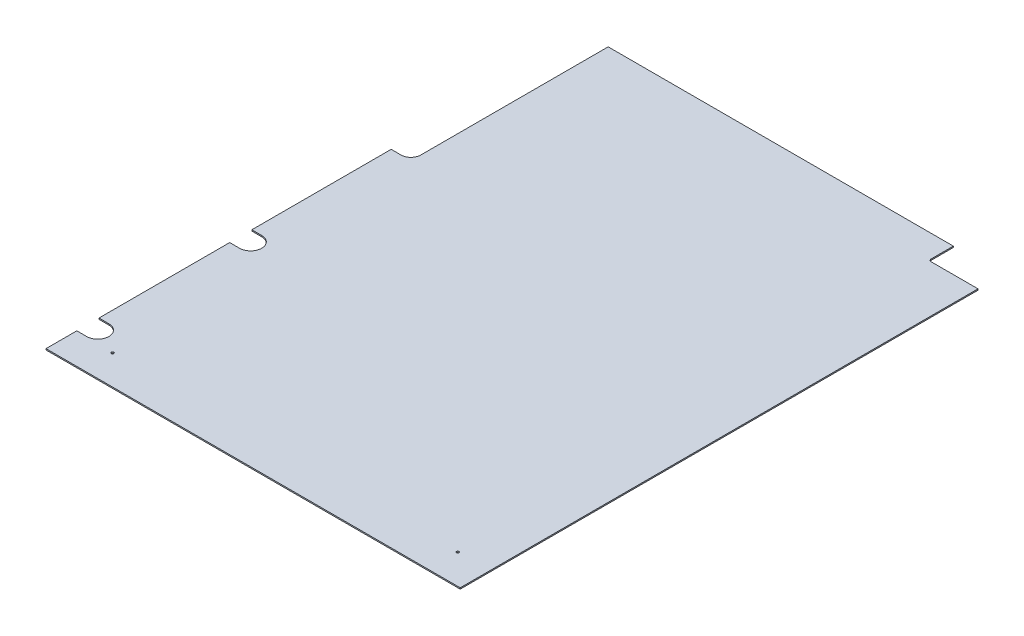
ISO-10303-21;
HEADER;
FILE_DESCRIPTION(('STEP AP214'),'2;1');
FILE_NAME('part.step','',(''),(''),'','','');
FILE_SCHEMA(('AUTOMOTIVE_DESIGN { 1 0 10303 214 1 1 1 1 }'));
ENDSEC;
DATA;
#1=APPLICATION_CONTEXT('core data for automotive mechanical design processes');
#2=APPLICATION_PROTOCOL_DEFINITION('international standard','automotive_design',2000,#1);
#3=PRODUCT_CONTEXT('',#1,'mechanical');
#4=PRODUCT('Part','Part','',(#3));
#5=PRODUCT_RELATED_PRODUCT_CATEGORY('part','',(#4));
#6=PRODUCT_DEFINITION_FORMATION('','',#4);
#7=PRODUCT_DEFINITION_CONTEXT('part definition',#1,'design');
#8=PRODUCT_DEFINITION('design','',#6,#7);
#9=PRODUCT_DEFINITION_SHAPE('','',#8);
#10=(LENGTH_UNIT() NAMED_UNIT(*) SI_UNIT(.MILLI.,.METRE.));
#11=(NAMED_UNIT(*) PLANE_ANGLE_UNIT() SI_UNIT($,.RADIAN.));
#12=(NAMED_UNIT(*) SI_UNIT($,.STERADIAN.) SOLID_ANGLE_UNIT());
#13=UNCERTAINTY_MEASURE_WITH_UNIT(LENGTH_MEASURE(1.E-05),#10,'distance_accuracy_value','');
#14=(GEOMETRIC_REPRESENTATION_CONTEXT(3) GLOBAL_UNCERTAINTY_ASSIGNED_CONTEXT((#13)) GLOBAL_UNIT_ASSIGNED_CONTEXT((#10,
#11,#12)) REPRESENTATION_CONTEXT('',''));
#15=CARTESIAN_POINT('',(0.,0.,0.));
#16=DIRECTION('',(0.,0.,1.));
#17=DIRECTION('',(1.,0.,0.));
#18=AXIS2_PLACEMENT_3D('',#15,#16,#17);
#19=CARTESIAN_POINT('',(0.,-540.385,698.5));
#20=DIRECTION('',(0.,-1.,0.));
#21=DIRECTION('',(0.,0.,-1.));
#22=AXIS2_PLACEMENT_3D('',#19,#20,#21);
#23=PLANE('',#22);
#24=CARTESIAN_POINT('',(-438.15,-540.385000000015,1320.8));
#25=DIRECTION('',(0.,1.,0.));
#26=DIRECTION('',(0.,0.,1.));
#27=AXIS2_PLACEMENT_3D('',#24,#25,#26);
#28=CIRCLE('',#27,3.175);
#29=CARTESIAN_POINT('',(-438.15,-540.385000000015,1323.975));
#30=VERTEX_POINT('',#29);
#31=EDGE_CURVE('E259',#30,#30,#28,.T.);
#32=ORIENTED_EDGE('',*,*,#31,.T.);
#33=EDGE_LOOP('',(#32));
#34=FACE_BOUND('',#33,.T.);
#35=CARTESIAN_POINT('',(450.85,-540.385000000015,1320.8));
#36=DIRECTION('',(0.,1.,0.));
#37=DIRECTION('',(0.,0.,1.));
#38=AXIS2_PLACEMENT_3D('',#35,#36,#37);
#39=CIRCLE('',#38,3.175);
#40=CARTESIAN_POINT('',(450.85,-540.385000000015,1323.975));
#41=VERTEX_POINT('',#40);
#42=EDGE_CURVE('E262',#41,#41,#39,.T.);
#43=ORIENTED_EDGE('',*,*,#42,.T.);
#44=EDGE_LOOP('',(#43));
#45=FACE_BOUND('',#44,.T.);
#46=DIRECTION('',(0.,0.,1.));
#47=VECTOR('',#46,1.);
#48=CARTESIAN_POINT('',(-533.4,-540.385,417.48526692391));
#49=LINE('',#48,#47);
#50=CARTESIAN_POINT('',(-533.4,-540.385000000005,508.));
#51=VERTEX_POINT('',#50);
#52=CARTESIAN_POINT('',(-533.4,-540.385,866.775));
#53=VERTEX_POINT('',#52);
#54=EDGE_CURVE('E170',#51,#53,#49,.T.);
#55=ORIENTED_EDGE('',*,*,#54,.F.);
#56=DIRECTION('',(1.,0.,0.));
#57=VECTOR('',#56,1.);
#58=CARTESIAN_POINT('',(-523.056139861752,-540.385000000015,508.));
#59=LINE('',#58,#57);
#60=CARTESIAN_POINT('',(-508.,-540.385000000015,508.));
#61=VERTEX_POINT('',#60);
#62=EDGE_CURVE('E139',#51,#61,#59,.T.);
#63=ORIENTED_EDGE('',*,*,#62,.T.);
#64=CARTESIAN_POINT('',(-508.,-540.385000000015,482.6));
#65=DIRECTION('',(0.,1.,0.));
#66=DIRECTION('',(0.,0.,1.));
#67=AXIS2_PLACEMENT_3D('',#64,#65,#66);
#68=CIRCLE('',#67,25.4);
#69=CARTESIAN_POINT('',(-482.6,-540.385000000015,482.6));
#70=VERTEX_POINT('',#69);
#71=EDGE_CURVE('E20',#61,#70,#68,.T.);
#72=ORIENTED_EDGE('',*,*,#71,.T.);
#73=DIRECTION('',(0.,0.,-1.));
#74=VECTOR('',#73,1.);
#75=CARTESIAN_POINT('',(-482.6,-540.385000000015,228.674650192228));
#76=LINE('',#75,#74);
#77=CARTESIAN_POINT('',(-482.6,-540.385000000005,0.));
#78=VERTEX_POINT('',#77);
#79=EDGE_CURVE('E143',#70,#78,#76,.T.);
#80=ORIENTED_EDGE('',*,*,#79,.T.);
#81=DIRECTION('',(-1.,0.,0.));
#82=VECTOR('',#81,1.);
#83=CARTESIAN_POINT('',(0.,-540.385,0.));
#84=LINE('',#83,#82);
#85=CARTESIAN_POINT('',(406.4,-540.38500000001,0.));
#86=VERTEX_POINT('',#85);
#87=EDGE_CURVE('E155',#86,#78,#84,.T.);
#88=ORIENTED_EDGE('',*,*,#87,.F.);
#89=DIRECTION('',(0.,0.,1.));
#90=VECTOR('',#89,1.);
#91=CARTESIAN_POINT('',(406.4,-540.385000000015,11.7346785634458));
#92=LINE('',#91,#90);
#93=CARTESIAN_POINT('',(406.4,-540.385000000015,57.1499999999873));
#94=VERTEX_POINT('',#93);
#95=EDGE_CURVE('E227',#86,#94,#92,.T.);
#96=ORIENTED_EDGE('',*,*,#95,.T.);
#97=CARTESIAN_POINT('',(412.75,-540.385000000015,57.1499999999746));
#98=DIRECTION('',(0.,1.,0.));
#99=DIRECTION('',(0.,0.,1.));
#100=AXIS2_PLACEMENT_3D('',#97,#98,#99);
#101=CIRCLE('',#100,6.35);
#102=CARTESIAN_POINT('',(412.75,-540.385000000015,63.4999999999746));
#103=VERTEX_POINT('',#102);
#104=EDGE_CURVE('E270',#94,#103,#101,.T.);
#105=ORIENTED_EDGE('',*,*,#104,.T.);
#106=DIRECTION('',(1.,0.,0.));
#107=VECTOR('',#106,1.);
#108=CARTESIAN_POINT('',(496.01742320066,-540.385000000015,63.4999999999746));
#109=LINE('',#108,#107);
#110=CARTESIAN_POINT('',(533.4,-540.385000000005,63.4999999999915));
#111=VERTEX_POINT('',#110);
#112=EDGE_CURVE('E222',#103,#111,#109,.T.);
#113=ORIENTED_EDGE('',*,*,#112,.T.);
#114=DIRECTION('',(0.,0.,1.));
#115=VECTOR('',#114,1.);
#116=CARTESIAN_POINT('',(533.4,-540.385,-53.4399999999996));
#117=LINE('',#116,#115);
#118=CARTESIAN_POINT('',(533.4,-540.385,1397.));
#119=VERTEX_POINT('',#118);
#120=EDGE_CURVE('E214',#111,#119,#117,.T.);
#121=ORIENTED_EDGE('',*,*,#120,.T.);
#122=DIRECTION('',(1.,0.,0.));
#123=VECTOR('',#122,1.);
#124=CARTESIAN_POINT('',(-586.839999999898,-540.385,1397.));
#125=LINE('',#124,#123);
#126=CARTESIAN_POINT('',(-533.4,-540.385,1397.));
#127=VERTEX_POINT('',#126);
#128=EDGE_CURVE('E212',#127,#119,#125,.T.);
#129=ORIENTED_EDGE('',*,*,#128,.F.);
#130=DIRECTION('',(0.,0.,1.));
#131=VECTOR('',#130,1.);
#132=CARTESIAN_POINT('',(-533.4,-540.385,417.48526692391));
#133=LINE('',#132,#131);
#134=CARTESIAN_POINT('',(-533.4,-540.385,1317.625));
#135=VERTEX_POINT('',#134);
#136=EDGE_CURVE('E207',#135,#127,#133,.T.);
#137=ORIENTED_EDGE('',*,*,#136,.F.);
#138=DIRECTION('',(-1.,0.,0.));
#139=VECTOR('',#138,1.);
#140=CARTESIAN_POINT('',(-519.281672702294,-540.385,1317.625));
#141=LINE('',#140,#139);
#142=CARTESIAN_POINT('',(-508.,-540.385,1317.625));
#143=VERTEX_POINT('',#142);
#144=EDGE_CURVE('E201',#143,#135,#141,.T.);
#145=ORIENTED_EDGE('',*,*,#144,.F.);
#146=CARTESIAN_POINT('',(-508.,-540.385,1289.05));
#147=DIRECTION('',(0.,-1.,0.));
#148=DIRECTION('',(0.,0.,-1.));
#149=AXIS2_PLACEMENT_3D('',#146,#147,#148);
#150=CIRCLE('',#149,28.575);
#151=CARTESIAN_POINT('',(-508.,-540.385,1260.475));
#152=VERTEX_POINT('',#151);
#153=EDGE_CURVE('E268',#143,#152,#150,.F.);
#154=ORIENTED_EDGE('',*,*,#153,.T.);
#155=DIRECTION('',(-1.,0.,0.));
#156=VECTOR('',#155,1.);
#157=CARTESIAN_POINT('',(-522.157213757906,-540.385,1260.475));
#158=LINE('',#157,#156);
#159=CARTESIAN_POINT('',(-533.4,-540.385,1260.475));
#160=VERTEX_POINT('',#159);
#161=EDGE_CURVE('E193',#152,#160,#158,.T.);
#162=ORIENTED_EDGE('',*,*,#161,.T.);
#163=DIRECTION('',(0.,0.,1.));
#164=VECTOR('',#163,1.);
#165=CARTESIAN_POINT('',(-533.4,-540.385,417.48526692391));
#166=LINE('',#165,#164);
#167=CARTESIAN_POINT('',(-533.4,-540.385,923.925));
#168=VERTEX_POINT('',#167);
#169=EDGE_CURVE('E191',#168,#160,#166,.T.);
#170=ORIENTED_EDGE('',*,*,#169,.F.);
#171=DIRECTION('',(-1.,0.,0.));
#172=VECTOR('',#171,1.);
#173=CARTESIAN_POINT('',(-522.75812590279,-540.385,923.925));
#174=LINE('',#173,#172);
#175=CARTESIAN_POINT('',(-508.,-540.385,923.925));
#176=VERTEX_POINT('',#175);
#177=EDGE_CURVE('E185',#176,#168,#174,.T.);
#178=ORIENTED_EDGE('',*,*,#177,.F.);
#179=CARTESIAN_POINT('',(-508.,-540.385,895.35));
#180=DIRECTION('',(0.,-1.,0.));
#181=DIRECTION('',(0.,0.,-1.));
#182=AXIS2_PLACEMENT_3D('',#179,#180,#181);
#183=CIRCLE('',#182,28.575);
#184=CARTESIAN_POINT('',(-508.,-540.385,866.775));
#185=VERTEX_POINT('',#184);
#186=EDGE_CURVE('E265',#176,#185,#183,.F.);
#187=ORIENTED_EDGE('',*,*,#186,.T.);
#188=DIRECTION('',(-1.,0.,0.));
#189=VECTOR('',#188,1.);
#190=CARTESIAN_POINT('',(-522.857470839736,-540.385,866.775));
#191=LINE('',#190,#189);
#192=EDGE_CURVE('E171',#185,#53,#191,.T.);
#193=ORIENTED_EDGE('',*,*,#192,.T.);
#194=EDGE_LOOP('',(#55,#63,#72,#80,#88,#96,#105,#113,#121,#129,#137,#145,#154,#162,#170,#178,
#187,#193));
#195=FACE_BOUND('',#194,.T.);
#196=ADVANCED_FACE('F17',(#34,#45,#195),#23,.T.);
#197=CARTESIAN_POINT('',(-523.056139861752,500000.000000032,508.));
#198=DIRECTION('',(0.,0.,1.));
#199=DIRECTION('',(1.,0.,0.));
#200=AXIS2_PLACEMENT_3D('',#197,#198,#199);
#201=PLANE('',#200);
#202=ORIENTED_EDGE('',*,*,#62,.F.);
#203=DIRECTION('',(0.,1.,0.));
#204=VECTOR('',#203,1.);
#205=CARTESIAN_POINT('',(-533.4,-540.385,508.));
#206=LINE('',#205,#204);
#207=CARTESIAN_POINT('',(-533.4,-537.21,508.));
#208=VERTEX_POINT('',#207);
#209=EDGE_CURVE('E167',#208,#51,#206,.F.);
#210=ORIENTED_EDGE('',*,*,#209,.F.);
#211=DIRECTION('',(1.,0.,0.));
#212=VECTOR('',#211,1.);
#213=CARTESIAN_POINT('',(0.,-537.21,508.));
#214=LINE('',#213,#212);
#215=CARTESIAN_POINT('',(-508.,-537.210000000126,508.));
#216=VERTEX_POINT('',#215);
#217=EDGE_CURVE('E258',#208,#216,#214,.T.);
#218=ORIENTED_EDGE('',*,*,#217,.T.);
#219=DIRECTION('',(0.,1.,0.));
#220=VECTOR('',#219,1.);
#221=CARTESIAN_POINT('',(-508.,500000.000000032,508.));
#222=LINE('',#221,#220);
#223=EDGE_CURVE('E149',#216,#61,#222,.F.);
#224=ORIENTED_EDGE('',*,*,#223,.T.);
#225=EDGE_LOOP('',(#202,#210,#218,#224));
#226=FACE_BOUND('',#225,.T.);
#227=ADVANCED_FACE('F581',(#226),#201,.F.);
#228=CARTESIAN_POINT('',(-508.,500000.000000032,482.6));
#229=DIRECTION('',(0.,1.,0.));
#230=DIRECTION('',(0.,0.,1.));
#231=AXIS2_PLACEMENT_3D('',#228,#229,#230);
#232=CYLINDRICAL_SURFACE('',#231,25.4);
#233=ORIENTED_EDGE('',*,*,#71,.F.);
#234=ORIENTED_EDGE('',*,*,#223,.F.);
#235=CARTESIAN_POINT('',(-508.,-537.210000000243,482.6));
#236=DIRECTION('',(0.,1.,0.));
#237=DIRECTION('',(0.,0.,1.));
#238=AXIS2_PLACEMENT_3D('',#235,#236,#237);
#239=CIRCLE('',#238,25.4);
#240=CARTESIAN_POINT('',(-482.6,-537.210000000126,482.6));
#241=VERTEX_POINT('',#240);
#242=EDGE_CURVE('E160',#216,#241,#239,.T.);
#243=ORIENTED_EDGE('',*,*,#242,.T.);
#244=DIRECTION('',(0.,1.,0.));
#245=VECTOR('',#244,1.);
#246=CARTESIAN_POINT('',(-482.6,500000.000000032,482.6));
#247=LINE('',#246,#245);
#248=EDGE_CURVE('E148',#241,#70,#247,.F.);
#249=ORIENTED_EDGE('',*,*,#248,.T.);
#250=EDGE_LOOP('',(#233,#234,#243,#249));
#251=FACE_BOUND('',#250,.T.);
#252=ADVANCED_FACE('F158',(#251),#232,.F.);
#253=CARTESIAN_POINT('',(-482.6,500000.000000032,228.674650192228));
#254=DIRECTION('',(1.,0.,0.));
#255=DIRECTION('',(0.,0.,-1.));
#256=AXIS2_PLACEMENT_3D('',#253,#254,#255);
#257=PLANE('',#256);
#258=ORIENTED_EDGE('',*,*,#79,.F.);
#259=ORIENTED_EDGE('',*,*,#248,.F.);
#260=DIRECTION('',(0.,0.,-1.));
#261=VECTOR('',#260,1.);
#262=CARTESIAN_POINT('',(-482.6,-537.21,698.5));
#263=LINE('',#262,#261);
#264=CARTESIAN_POINT('',(-482.6,-537.21,0.));
#265=VERTEX_POINT('',#264);
#266=EDGE_CURVE('E257',#241,#265,#263,.T.);
#267=ORIENTED_EDGE('',*,*,#266,.T.);
#268=DIRECTION('',(0.,1.,0.));
#269=VECTOR('',#268,1.);
#270=CARTESIAN_POINT('',(-482.6,-540.385,0.));
#271=LINE('',#270,#269);
#272=EDGE_CURVE('E154',#78,#265,#271,.T.);
#273=ORIENTED_EDGE('',*,*,#272,.F.);
#274=EDGE_LOOP('',(#258,#259,#267,#273));
#275=FACE_BOUND('',#274,.T.);
#276=ADVANCED_FACE('F151',(#275),#257,.F.);
#277=CARTESIAN_POINT('',(0.,-540.385,0.));
#278=DIRECTION('',(0.,0.,-1.));
#279=DIRECTION('',(-1.,0.,0.));
#280=AXIS2_PLACEMENT_3D('',#277,#278,#279);
#281=PLANE('',#280);
#282=ORIENTED_EDGE('',*,*,#87,.T.);
#283=ORIENTED_EDGE('',*,*,#272,.T.);
#284=DIRECTION('',(1.,0.,0.));
#285=VECTOR('',#284,1.);
#286=CARTESIAN_POINT('',(0.,-537.21,0.));
#287=LINE('',#286,#285);
#288=CARTESIAN_POINT('',(406.4,-537.210000000005,0.));
#289=VERTEX_POINT('',#288);
#290=EDGE_CURVE('E286',#265,#289,#287,.T.);
#291=ORIENTED_EDGE('',*,*,#290,.T.);
#292=DIRECTION('',(0.,1.,0.));
#293=VECTOR('',#292,1.);
#294=CARTESIAN_POINT('',(406.4,500000.000000032,0.));
#295=LINE('',#294,#293);
#296=EDGE_CURVE('E230',#289,#86,#295,.F.);
#297=ORIENTED_EDGE('',*,*,#296,.T.);
#298=EDGE_LOOP('',(#282,#283,#291,#297));
#299=FACE_BOUND('',#298,.T.);
#300=ADVANCED_FACE('F292',(#299),#281,.T.);
#301=CARTESIAN_POINT('',(406.4,500000.000000032,11.7346785634458));
#302=DIRECTION('',(-1.,0.,0.));
#303=DIRECTION('',(0.,0.,1.));
#304=AXIS2_PLACEMENT_3D('',#301,#302,#303);
#305=PLANE('',#304);
#306=ORIENTED_EDGE('',*,*,#95,.F.);
#307=ORIENTED_EDGE('',*,*,#296,.F.);
#308=DIRECTION('',(0.,0.,-1.));
#309=VECTOR('',#308,1.);
#310=CARTESIAN_POINT('',(406.4,-537.21,698.5));
#311=LINE('',#310,#309);
#312=CARTESIAN_POINT('',(406.4,-537.210000000012,57.1499999999873));
#313=VERTEX_POINT('',#312);
#314=EDGE_CURVE('E255',#289,#313,#311,.F.);
#315=ORIENTED_EDGE('',*,*,#314,.T.);
#316=DIRECTION('',(0.,1.,0.));
#317=VECTOR('',#316,1.);
#318=CARTESIAN_POINT('',(406.4,500000.000000032,57.15));
#319=LINE('',#318,#317);
#320=EDGE_CURVE('E229',#313,#94,#319,.F.);
#321=ORIENTED_EDGE('',*,*,#320,.T.);
#322=EDGE_LOOP('',(#306,#307,#315,#321));
#323=FACE_BOUND('',#322,.T.);
#324=ADVANCED_FACE('F395',(#323),#305,.F.);
#325=CARTESIAN_POINT('',(412.75,500000.000000032,57.1499999999746));
#326=DIRECTION('',(0.,1.,0.));
#327=DIRECTION('',(0.,0.,1.));
#328=AXIS2_PLACEMENT_3D('',#325,#326,#327);
#329=CYLINDRICAL_SURFACE('',#328,6.35);
#330=ORIENTED_EDGE('',*,*,#104,.F.);
#331=ORIENTED_EDGE('',*,*,#320,.F.);
#332=CARTESIAN_POINT('',(412.75,-537.210000000016,57.1499999999746));
#333=DIRECTION('',(0.,1.,0.));
#334=DIRECTION('',(0.,0.,1.));
#335=AXIS2_PLACEMENT_3D('',#332,#333,#334);
#336=CIRCLE('',#335,6.35);
#337=CARTESIAN_POINT('',(412.75,-537.210000000012,63.4999999999746));
#338=VERTEX_POINT('',#337);
#339=EDGE_CURVE('E251',#313,#338,#336,.T.);
#340=ORIENTED_EDGE('',*,*,#339,.T.);
#341=DIRECTION('',(0.,1.,0.));
#342=VECTOR('',#341,1.);
#343=CARTESIAN_POINT('',(412.75,500000.000000032,63.4999999999746));
#344=LINE('',#343,#342);
#345=EDGE_CURVE('E224',#338,#103,#344,.F.);
#346=ORIENTED_EDGE('',*,*,#345,.T.);
#347=EDGE_LOOP('',(#330,#331,#340,#346));
#348=FACE_BOUND('',#347,.T.);
#349=ADVANCED_FACE('F397',(#348),#329,.F.);
#350=CARTESIAN_POINT('',(496.01742320066,500000.000000032,63.4999999999746));
#351=DIRECTION('',(0.,0.,1.));
#352=DIRECTION('',(1.,0.,0.));
#353=AXIS2_PLACEMENT_3D('',#350,#351,#352);
#354=PLANE('',#353);
#355=ORIENTED_EDGE('',*,*,#112,.F.);
#356=ORIENTED_EDGE('',*,*,#345,.F.);
#357=DIRECTION('',(1.,0.,0.));
#358=VECTOR('',#357,1.);
#359=CARTESIAN_POINT('',(0.,-537.21,63.4999999999746));
#360=LINE('',#359,#358);
#361=CARTESIAN_POINT('',(533.4,-537.21,63.4999999999831));
#362=VERTEX_POINT('',#361);
#363=EDGE_CURVE('E254',#338,#362,#360,.T.);
#364=ORIENTED_EDGE('',*,*,#363,.T.);
#365=DIRECTION('',(0.,1.,0.));
#366=VECTOR('',#365,1.);
#367=CARTESIAN_POINT('',(533.4,-540.385,63.5));
#368=LINE('',#367,#366);
#369=EDGE_CURVE('E219',#362,#111,#368,.F.);
#370=ORIENTED_EDGE('',*,*,#369,.T.);
#371=EDGE_LOOP('',(#355,#356,#364,#370));
#372=FACE_BOUND('',#371,.T.);
#373=ADVANCED_FACE('F362',(#372),#354,.F.);
#374=CARTESIAN_POINT('',(533.4,-540.385,-53.4399999999996));
#375=DIRECTION('',(-1.,0.,0.));
#376=DIRECTION('',(0.,0.,1.));
#377=AXIS2_PLACEMENT_3D('',#374,#375,#376);
#378=PLANE('',#377);
#379=DIRECTION('',(0.,1.,0.));
#380=VECTOR('',#379,1.);
#381=CARTESIAN_POINT('',(533.4,-540.385,1397.));
#382=LINE('',#381,#380);
#383=CARTESIAN_POINT('',(533.4,-537.21,1397.));
#384=VERTEX_POINT('',#383);
#385=EDGE_CURVE('E209',#119,#384,#382,.T.);
#386=ORIENTED_EDGE('',*,*,#385,.F.);
#387=ORIENTED_EDGE('',*,*,#120,.F.);
#388=ORIENTED_EDGE('',*,*,#369,.F.);
#389=DIRECTION('',(0.,0.,-1.));
#390=VECTOR('',#389,1.);
#391=CARTESIAN_POINT('',(533.4,-537.21,698.5));
#392=LINE('',#391,#390);
#393=EDGE_CURVE('E348',#362,#384,#392,.F.);
#394=ORIENTED_EDGE('',*,*,#393,.T.);
#395=EDGE_LOOP('',(#386,#387,#388,#394));
#396=FACE_BOUND('',#395,.T.);
#397=ADVANCED_FACE('F368',(#396),#378,.F.);
#398=CARTESIAN_POINT('',(-586.839999999898,-540.385,1397.));
#399=DIRECTION('',(0.,0.,1.));
#400=DIRECTION('',(1.,0.,0.));
#401=AXIS2_PLACEMENT_3D('',#398,#399,#400);
#402=PLANE('',#401);
#403=ORIENTED_EDGE('',*,*,#385,.T.);
#404=DIRECTION('',(1.,0.,0.));
#405=VECTOR('',#404,1.);
#406=CARTESIAN_POINT('',(0.,-537.21,1397.));
#407=LINE('',#406,#405);
#408=CARTESIAN_POINT('',(-533.4,-537.21,1397.));
#409=VERTEX_POINT('',#408);
#410=EDGE_CURVE('E340',#384,#409,#407,.F.);
#411=ORIENTED_EDGE('',*,*,#410,.T.);
#412=DIRECTION('',(0.,1.,0.));
#413=VECTOR('',#412,1.);
#414=CARTESIAN_POINT('',(-533.4,-540.385,1397.));
#415=LINE('',#414,#413);
#416=EDGE_CURVE('E204',#127,#409,#415,.T.);
#417=ORIENTED_EDGE('',*,*,#416,.F.);
#418=ORIENTED_EDGE('',*,*,#128,.T.);
#419=EDGE_LOOP('',(#403,#411,#417,#418));
#420=FACE_BOUND('',#419,.T.);
#421=ADVANCED_FACE('F374',(#420),#402,.T.);
#422=CARTESIAN_POINT('',(-533.4,-540.385,417.48526692391));
#423=DIRECTION('',(-1.,0.,0.));
#424=DIRECTION('',(0.,0.,1.));
#425=AXIS2_PLACEMENT_3D('',#422,#423,#424);
#426=PLANE('',#425);
#427=ORIENTED_EDGE('',*,*,#416,.T.);
#428=DIRECTION('',(0.,0.,-1.));
#429=VECTOR('',#428,1.);
#430=CARTESIAN_POINT('',(-533.4,-537.21,698.5));
#431=LINE('',#430,#429);
#432=CARTESIAN_POINT('',(-533.4,-537.21,1317.625));
#433=VERTEX_POINT('',#432);
#434=EDGE_CURVE('E337',#409,#433,#431,.T.);
#435=ORIENTED_EDGE('',*,*,#434,.T.);
#436=DIRECTION('',(0.,1.,0.));
#437=VECTOR('',#436,1.);
#438=CARTESIAN_POINT('',(-533.4,-540.385,1317.625));
#439=LINE('',#438,#437);
#440=EDGE_CURVE('E203',#135,#433,#439,.T.);
#441=ORIENTED_EDGE('',*,*,#440,.F.);
#442=ORIENTED_EDGE('',*,*,#136,.T.);
#443=EDGE_LOOP('',(#427,#435,#441,#442));
#444=FACE_BOUND('',#443,.T.);
#445=ADVANCED_FACE('F380',(#444),#426,.T.);
#446=CARTESIAN_POINT('',(-519.281672702294,-540.385,1317.625));
#447=DIRECTION('',(0.,0.,-1.));
#448=DIRECTION('',(-1.,0.,0.));
#449=AXIS2_PLACEMENT_3D('',#446,#447,#448);
#450=PLANE('',#449);
#451=ORIENTED_EDGE('',*,*,#440,.T.);
#452=DIRECTION('',(1.,0.,0.));
#453=VECTOR('',#452,1.);
#454=CARTESIAN_POINT('',(0.,-537.21,1317.625));
#455=LINE('',#454,#453);
#456=CARTESIAN_POINT('',(-508.,-537.21,1317.625));
#457=VERTEX_POINT('',#456);
#458=EDGE_CURVE('E250',#433,#457,#455,.T.);
#459=ORIENTED_EDGE('',*,*,#458,.T.);
#460=DIRECTION('',(0.,-1.,0.));
#461=VECTOR('',#460,1.);
#462=CARTESIAN_POINT('',(-508.,-540.385,1317.625));
#463=LINE('',#462,#461);
#464=EDGE_CURVE('E269',#457,#143,#463,.T.);
#465=ORIENTED_EDGE('',*,*,#464,.T.);
#466=ORIENTED_EDGE('',*,*,#144,.T.);
#467=EDGE_LOOP('',(#451,#459,#465,#466));
#468=FACE_BOUND('',#467,.T.);
#469=ADVANCED_FACE('F383',(#468),#450,.T.);
#470=CARTESIAN_POINT('',(-508.,-540.385,1289.05));
#471=DIRECTION('',(0.,-1.,0.));
#472=DIRECTION('',(0.,0.,-1.));
#473=AXIS2_PLACEMENT_3D('',#470,#471,#472);
#474=CYLINDRICAL_SURFACE('',#473,28.575);
#475=ORIENTED_EDGE('',*,*,#153,.F.);
#476=ORIENTED_EDGE('',*,*,#464,.F.);
#477=CARTESIAN_POINT('',(-508.,-537.21,1289.05));
#478=DIRECTION('',(0.,-1.,0.));
#479=DIRECTION('',(0.,0.,-1.));
#480=AXIS2_PLACEMENT_3D('',#477,#478,#479);
#481=CIRCLE('',#480,28.575);
#482=CARTESIAN_POINT('',(-508.,-537.21,1260.475));
#483=VERTEX_POINT('',#482);
#484=EDGE_CURVE('E246',#457,#483,#481,.F.);
#485=ORIENTED_EDGE('',*,*,#484,.T.);
#486=DIRECTION('',(0.,1.,0.));
#487=VECTOR('',#486,1.);
#488=CARTESIAN_POINT('',(-508.,-540.385,1260.475));
#489=LINE('',#488,#487);
#490=EDGE_CURVE('E198',#483,#152,#489,.F.);
#491=ORIENTED_EDGE('',*,*,#490,.T.);
#492=EDGE_LOOP('',(#475,#476,#485,#491));
#493=FACE_BOUND('',#492,.T.);
#494=ADVANCED_FACE('F445',(#493),#474,.F.);
#495=CARTESIAN_POINT('',(-522.157213757906,-540.385,1260.475));
#496=DIRECTION('',(0.,0.,-1.));
#497=DIRECTION('',(-1.,0.,0.));
#498=AXIS2_PLACEMENT_3D('',#495,#496,#497);
#499=PLANE('',#498);
#500=ORIENTED_EDGE('',*,*,#161,.F.);
#501=ORIENTED_EDGE('',*,*,#490,.F.);
#502=DIRECTION('',(1.,0.,0.));
#503=VECTOR('',#502,1.);
#504=CARTESIAN_POINT('',(0.,-537.21,1260.475));
#505=LINE('',#504,#503);
#506=CARTESIAN_POINT('',(-533.4,-537.21,1260.475));
#507=VERTEX_POINT('',#506);
#508=EDGE_CURVE('E249',#483,#507,#505,.F.);
#509=ORIENTED_EDGE('',*,*,#508,.T.);
#510=DIRECTION('',(0.,1.,0.));
#511=VECTOR('',#510,1.);
#512=CARTESIAN_POINT('',(-533.4,-540.385,1260.475));
#513=LINE('',#512,#511);
#514=EDGE_CURVE('E188',#160,#507,#513,.T.);
#515=ORIENTED_EDGE('',*,*,#514,.F.);
#516=EDGE_LOOP('',(#500,#501,#509,#515));
#517=FACE_BOUND('',#516,.T.);
#518=ADVANCED_FACE('F441',(#517),#499,.F.);
#519=CARTESIAN_POINT('',(-533.4,-540.385,417.48526692391));
#520=DIRECTION('',(-1.,0.,0.));
#521=DIRECTION('',(0.,0.,1.));
#522=AXIS2_PLACEMENT_3D('',#519,#520,#521);
#523=PLANE('',#522);
#524=ORIENTED_EDGE('',*,*,#514,.T.);
#525=DIRECTION('',(0.,0.,-1.));
#526=VECTOR('',#525,1.);
#527=CARTESIAN_POINT('',(-533.4,-537.21,698.5));
#528=LINE('',#527,#526);
#529=CARTESIAN_POINT('',(-533.4,-537.21,923.925));
#530=VERTEX_POINT('',#529);
#531=EDGE_CURVE('E322',#507,#530,#528,.T.);
#532=ORIENTED_EDGE('',*,*,#531,.T.);
#533=DIRECTION('',(0.,1.,0.));
#534=VECTOR('',#533,1.);
#535=CARTESIAN_POINT('',(-533.4,-540.385,923.925));
#536=LINE('',#535,#534);
#537=EDGE_CURVE('E187',#168,#530,#536,.T.);
#538=ORIENTED_EDGE('',*,*,#537,.F.);
#539=ORIENTED_EDGE('',*,*,#169,.T.);
#540=EDGE_LOOP('',(#524,#532,#538,#539));
#541=FACE_BOUND('',#540,.T.);
#542=ADVANCED_FACE('F437',(#541),#523,.T.);
#543=CARTESIAN_POINT('',(-522.75812590279,-540.385,923.925));
#544=DIRECTION('',(0.,0.,-1.));
#545=DIRECTION('',(-1.,0.,0.));
#546=AXIS2_PLACEMENT_3D('',#543,#544,#545);
#547=PLANE('',#546);
#548=ORIENTED_EDGE('',*,*,#537,.T.);
#549=DIRECTION('',(1.,0.,0.));
#550=VECTOR('',#549,1.);
#551=CARTESIAN_POINT('',(0.,-537.21,923.925));
#552=LINE('',#551,#550);
#553=CARTESIAN_POINT('',(-508.,-537.21,923.925));
#554=VERTEX_POINT('',#553);
#555=EDGE_CURVE('E245',#530,#554,#552,.T.);
#556=ORIENTED_EDGE('',*,*,#555,.T.);
#557=DIRECTION('',(0.,-1.,0.));
#558=VECTOR('',#557,1.);
#559=CARTESIAN_POINT('',(-508.,-540.385,923.925));
#560=LINE('',#559,#558);
#561=EDGE_CURVE('E267',#554,#176,#560,.T.);
#562=ORIENTED_EDGE('',*,*,#561,.T.);
#563=ORIENTED_EDGE('',*,*,#177,.T.);
#564=EDGE_LOOP('',(#548,#556,#562,#563));
#565=FACE_BOUND('',#564,.T.);
#566=ADVANCED_FACE('F433',(#565),#547,.T.);
#567=CARTESIAN_POINT('',(-508.,-540.385,895.35));
#568=DIRECTION('',(0.,-1.,0.));
#569=DIRECTION('',(0.,0.,-1.));
#570=AXIS2_PLACEMENT_3D('',#567,#568,#569);
#571=CYLINDRICAL_SURFACE('',#570,28.575);
#572=ORIENTED_EDGE('',*,*,#186,.F.);
#573=ORIENTED_EDGE('',*,*,#561,.F.);
#574=CARTESIAN_POINT('',(-508.,-537.21,895.35));
#575=DIRECTION('',(0.,-1.,0.));
#576=DIRECTION('',(0.,0.,-1.));
#577=AXIS2_PLACEMENT_3D('',#574,#575,#576);
#578=CIRCLE('',#577,28.575);
#579=CARTESIAN_POINT('',(-508.,-537.21,866.775));
#580=VERTEX_POINT('',#579);
#581=EDGE_CURVE('E241',#554,#580,#578,.F.);
#582=ORIENTED_EDGE('',*,*,#581,.T.);
#583=DIRECTION('',(0.,1.,0.));
#584=VECTOR('',#583,1.);
#585=CARTESIAN_POINT('',(-508.,-540.385,866.775));
#586=LINE('',#585,#584);
#587=EDGE_CURVE('E176',#580,#185,#586,.F.);
#588=ORIENTED_EDGE('',*,*,#587,.T.);
#589=EDGE_LOOP('',(#572,#573,#582,#588));
#590=FACE_BOUND('',#589,.T.);
#591=ADVANCED_FACE('F429',(#590),#571,.F.);
#592=CARTESIAN_POINT('',(-522.857470839736,-540.385,866.775));
#593=DIRECTION('',(0.,0.,-1.));
#594=DIRECTION('',(-1.,0.,0.));
#595=AXIS2_PLACEMENT_3D('',#592,#593,#594);
#596=PLANE('',#595);
#597=ORIENTED_EDGE('',*,*,#192,.F.);
#598=ORIENTED_EDGE('',*,*,#587,.F.);
#599=DIRECTION('',(1.,0.,0.));
#600=VECTOR('',#599,1.);
#601=CARTESIAN_POINT('',(0.,-537.21,866.775));
#602=LINE('',#601,#600);
#603=CARTESIAN_POINT('',(-533.4,-537.21,866.775));
#604=VERTEX_POINT('',#603);
#605=EDGE_CURVE('E244',#580,#604,#602,.F.);
#606=ORIENTED_EDGE('',*,*,#605,.T.);
#607=DIRECTION('',(0.,1.,0.));
#608=VECTOR('',#607,1.);
#609=CARTESIAN_POINT('',(-533.4,-540.385,866.775));
#610=LINE('',#609,#608);
#611=EDGE_CURVE('E35',#53,#604,#610,.T.);
#612=ORIENTED_EDGE('',*,*,#611,.F.);
#613=EDGE_LOOP('',(#597,#598,#606,#612));
#614=FACE_BOUND('',#613,.T.);
#615=ADVANCED_FACE('F426',(#614),#596,.F.);
#616=CARTESIAN_POINT('',(-533.4,-540.385,417.48526692391));
#617=DIRECTION('',(-1.,0.,0.));
#618=DIRECTION('',(0.,0.,1.));
#619=AXIS2_PLACEMENT_3D('',#616,#617,#618);
#620=PLANE('',#619);
#621=ORIENTED_EDGE('',*,*,#611,.T.);
#622=DIRECTION('',(0.,0.,-1.));
#623=VECTOR('',#622,1.);
#624=CARTESIAN_POINT('',(-533.4,-537.21,698.5));
#625=LINE('',#624,#623);
#626=EDGE_CURVE('E240',#604,#208,#625,.T.);
#627=ORIENTED_EDGE('',*,*,#626,.T.);
#628=ORIENTED_EDGE('',*,*,#209,.T.);
#629=ORIENTED_EDGE('',*,*,#54,.T.);
#630=EDGE_LOOP('',(#621,#627,#628,#629));
#631=FACE_BOUND('',#630,.T.);
#632=ADVANCED_FACE('F422',(#631),#620,.T.);
#633=CARTESIAN_POINT('',(450.85,500000.000000032,1320.8));
#634=DIRECTION('',(0.,1.,0.));
#635=DIRECTION('',(0.,0.,1.));
#636=AXIS2_PLACEMENT_3D('',#633,#634,#635);
#637=CYLINDRICAL_SURFACE('',#636,3.175);
#638=CARTESIAN_POINT('',(450.85,-537.210000000243,1320.8));
#639=DIRECTION('',(0.,1.,0.));
#640=DIRECTION('',(0.,0.,1.));
#641=AXIS2_PLACEMENT_3D('',#638,#639,#640);
#642=CIRCLE('',#641,3.175);
#643=CARTESIAN_POINT('',(450.85,-537.210000000243,1323.975));
#644=VERTEX_POINT('',#643);
#645=EDGE_CURVE('E26',#644,#644,#642,.T.);
#646=ORIENTED_EDGE('',*,*,#645,.T.);
#647=EDGE_LOOP('',(#646));
#648=FACE_BOUND('',#647,.T.);
#649=ORIENTED_EDGE('',*,*,#42,.F.);
#650=EDGE_LOOP('',(#649));
#651=FACE_BOUND('',#650,.T.);
#652=ADVANCED_FACE('F414',(#648,#651),#637,.F.);
#653=CARTESIAN_POINT('',(-438.15,500000.000000032,1320.8));
#654=DIRECTION('',(0.,1.,0.));
#655=DIRECTION('',(0.,0.,1.));
#656=AXIS2_PLACEMENT_3D('',#653,#654,#655);
#657=CYLINDRICAL_SURFACE('',#656,3.175);
#658=CARTESIAN_POINT('',(-438.15,-537.210000000243,1320.8));
#659=DIRECTION('',(0.,1.,0.));
#660=DIRECTION('',(0.,0.,1.));
#661=AXIS2_PLACEMENT_3D('',#658,#659,#660);
#662=CIRCLE('',#661,3.175);
#663=CARTESIAN_POINT('',(-438.15,-537.210000000243,1323.975));
#664=VERTEX_POINT('',#663);
#665=EDGE_CURVE('E11',#664,#664,#662,.T.);
#666=ORIENTED_EDGE('',*,*,#665,.T.);
#667=EDGE_LOOP('',(#666));
#668=FACE_BOUND('',#667,.T.);
#669=ORIENTED_EDGE('',*,*,#31,.F.);
#670=EDGE_LOOP('',(#669));
#671=FACE_BOUND('',#670,.T.);
#672=ADVANCED_FACE('F408',(#668,#671),#657,.F.);
#673=CARTESIAN_POINT('',(0.,-537.21,698.5));
#674=DIRECTION('',(0.,-1.,0.));
#675=DIRECTION('',(0.,0.,-1.));
#676=AXIS2_PLACEMENT_3D('',#673,#674,#675);
#677=PLANE('',#676);
#678=ORIENTED_EDGE('',*,*,#665,.F.);
#679=EDGE_LOOP('',(#678));
#680=FACE_BOUND('',#679,.T.);
#681=ORIENTED_EDGE('',*,*,#645,.F.);
#682=EDGE_LOOP('',(#681));
#683=FACE_BOUND('',#682,.T.);
#684=ORIENTED_EDGE('',*,*,#605,.F.);
#685=ORIENTED_EDGE('',*,*,#581,.F.);
#686=ORIENTED_EDGE('',*,*,#555,.F.);
#687=ORIENTED_EDGE('',*,*,#531,.F.);
#688=ORIENTED_EDGE('',*,*,#508,.F.);
#689=ORIENTED_EDGE('',*,*,#484,.F.);
#690=ORIENTED_EDGE('',*,*,#458,.F.);
#691=ORIENTED_EDGE('',*,*,#434,.F.);
#692=ORIENTED_EDGE('',*,*,#410,.F.);
#693=ORIENTED_EDGE('',*,*,#393,.F.);
#694=ORIENTED_EDGE('',*,*,#363,.F.);
#695=ORIENTED_EDGE('',*,*,#339,.F.);
#696=ORIENTED_EDGE('',*,*,#314,.F.);
#697=ORIENTED_EDGE('',*,*,#290,.F.);
#698=ORIENTED_EDGE('',*,*,#266,.F.);
#699=ORIENTED_EDGE('',*,*,#242,.F.);
#700=ORIENTED_EDGE('',*,*,#217,.F.);
#701=ORIENTED_EDGE('',*,*,#626,.F.);
#702=EDGE_LOOP('',(#684,#685,#686,#687,#688,#689,#690,#691,#692,#693,#694,#695,#696,#697,#698,
#699,#700,#701));
#703=FACE_BOUND('',#702,.T.);
#704=ADVANCED_FACE('F296',(#680,#683,#703),#677,.F.);
#705=CLOSED_SHELL('',(#196,#227,#252,#276,#300,#324,#349,#373,#397,#421,#445,#469,#494,#518,
#542,#566,#591,#615,#632,#652,#672,#704));
#706=MANIFOLD_SOLID_BREP('B1',#705);
#707=ADVANCED_BREP_SHAPE_REPRESENTATION('',(#18,#706),#14);
#708=SHAPE_DEFINITION_REPRESENTATION(#9,#707);
ENDSEC;
END-ISO-10303-21;
